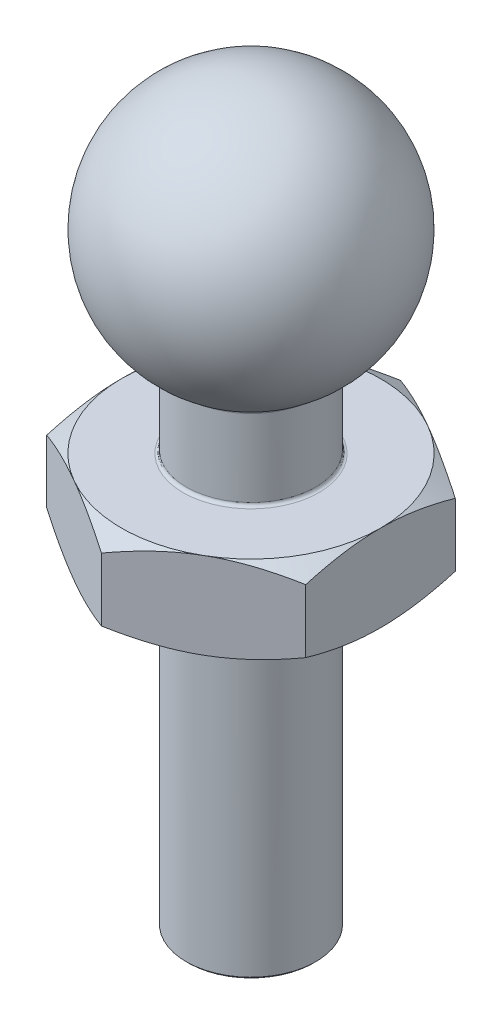
ISO-10303-21;
HEADER;
FILE_DESCRIPTION(('STEP AP214'),'2;1');
FILE_NAME('part.step','',(''),(''),'','','');
FILE_SCHEMA(('AUTOMOTIVE_DESIGN { 1 0 10303 214 1 1 1 1 }'));
ENDSEC;
DATA;
#1=APPLICATION_CONTEXT('core data for automotive mechanical design processes');
#2=APPLICATION_PROTOCOL_DEFINITION('international standard','automotive_design',2000,#1);
#3=PRODUCT_CONTEXT('',#1,'mechanical');
#4=PRODUCT('Part','Part','',(#3));
#5=PRODUCT_RELATED_PRODUCT_CATEGORY('part','',(#4));
#6=PRODUCT_DEFINITION_FORMATION('','',#4);
#7=PRODUCT_DEFINITION_CONTEXT('part definition',#1,'design');
#8=PRODUCT_DEFINITION('design','',#6,#7);
#9=PRODUCT_DEFINITION_SHAPE('','',#8);
#10=(LENGTH_UNIT() NAMED_UNIT(*) SI_UNIT(.MILLI.,.METRE.));
#11=(NAMED_UNIT(*) PLANE_ANGLE_UNIT() SI_UNIT($,.RADIAN.));
#12=(NAMED_UNIT(*) SI_UNIT($,.STERADIAN.) SOLID_ANGLE_UNIT());
#13=UNCERTAINTY_MEASURE_WITH_UNIT(LENGTH_MEASURE(1.E-05),#10,'distance_accuracy_value','');
#14=(GEOMETRIC_REPRESENTATION_CONTEXT(3) GLOBAL_UNCERTAINTY_ASSIGNED_CONTEXT((#13)) GLOBAL_UNIT_ASSIGNED_CONTEXT((#10,
#11,#12)) REPRESENTATION_CONTEXT('',''));
#15=CARTESIAN_POINT('',(0.,0.,0.));
#16=DIRECTION('',(0.,0.,1.));
#17=DIRECTION('',(1.,0.,0.));
#18=AXIS2_PLACEMENT_3D('',#15,#16,#17);
#19=CARTESIAN_POINT('',(0.,9.5,3.46410161513776));
#20=DIRECTION('',(-0.499999999999999,0.,-0.866025403784439));
#21=DIRECTION('',(-0.866025403784439,0.,0.499999999999999));
#22=AXIS2_PLACEMENT_3D('',#19,#20,#21);
#23=PLANE('',#22);
#24=CARTESIAN_POINT('',(-0.000200000000000046,9.23198413756899,3.46421708519159));
#25=CARTESIAN_POINT('',(0.131635206588332,9.27594629554769,3.38810199317915));
#26=CARTESIAN_POINT('',(0.264608405355249,9.31592841370737,3.31132988107607));
#27=CARTESIAN_POINT('',(0.532857420002056,9.38571791955454,3.15645624025988));
#28=CARTESIAN_POINT('',(0.668138002634342,9.41550061773462,3.078351959461));
#29=CARTESIAN_POINT('',(0.937022602096484,9.46186216078874,2.92311136358059));
#30=CARTESIAN_POINT('',(1.07058524542946,9.47874955887705,2.84599893549862));
#31=CARTESIAN_POINT('',(1.33833905729569,9.49891035755148,2.6914112001411));
#32=CARTESIAN_POINT('',(1.47252925247984,9.50220045221892,2.61393645482892));
#33=CARTESIAN_POINT('',(1.72327559769581,9.49535946911461,2.46916798492017));
#34=CARTESIAN_POINT('',(1.83986926497268,9.48690808580738,2.40185259973206));
#35=CARTESIAN_POINT('',(2.07229698497464,9.46012105699296,2.2676603930218));
#36=CARTESIAN_POINT('',(2.18813023365133,9.44177625913829,2.2007840357172));
#37=CARTESIAN_POINT('',(2.42103725705637,9.39591524914667,2.06631510305815));
#38=CARTESIAN_POINT('',(2.53808155051394,9.36820461473692,1.99873954872331));
#39=CARTESIAN_POINT('',(2.77042435049912,9.3053122048626,1.86459637060759));
#40=CARTESIAN_POINT('',(2.88572583417111,9.27014520897844,1.79802702797161));
#41=CARTESIAN_POINT('',(3.0002,9.23198413756899,1.73193533751504));
#42=B_SPLINE_CURVE_WITH_KNOTS('',3,(#24,#25,#26,#27,#28,#29,#30,#31,#32,#33,#34,#35,#36,#37,#38,
#39,#40,#41),.UNSPECIFIED.,.F.,.F.,(4,2,2,2,2,2,2,2,4),(0.,0.475539830103041,0.952222784107964,
1.41710776961288,1.88142182298026,2.28572436316091,2.69040156475039,3.10405572063576,
3.5168974940707),.UNSPECIFIED.);
#43=CARTESIAN_POINT('',(0.,9.23205080756888,3.46410161513776));
#44=VERTEX_POINT('',#43);
#45=CARTESIAN_POINT('',(1.5,9.5,2.59807621135332));
#46=VERTEX_POINT('',#45);
#47=EDGE_CURVE('E165',#44,#46,#42,.T.);
#48=ORIENTED_EDGE('',*,*,#47,.F.);
#49=DIRECTION('',(0.,-1.,0.));
#50=VECTOR('',#49,1.);
#51=CARTESIAN_POINT('',(0.,9.5,3.46410161513776));
#52=LINE('',#51,#50);
#53=CARTESIAN_POINT('',(0.,7.76794919243112,3.46410161513776));
#54=VERTEX_POINT('',#53);
#55=EDGE_CURVE('E304',#44,#54,#52,.T.);
#56=ORIENTED_EDGE('',*,*,#55,.T.);
#57=CARTESIAN_POINT('',(3.0002,7.76801586243101,1.73193533751504));
#58=CARTESIAN_POINT('',(2.86836479341167,7.72405370445231,1.80805042952749));
#59=CARTESIAN_POINT('',(2.73539159464475,7.68407158629263,1.88482254163057));
#60=CARTESIAN_POINT('',(2.46714257999794,7.61428208044547,2.03969618244676));
#61=CARTESIAN_POINT('',(2.33186199736566,7.58449938226538,2.11780046324564));
#62=CARTESIAN_POINT('',(2.06297739790352,7.53813783921126,2.27304105912605));
#63=CARTESIAN_POINT('',(1.92941475457054,7.52125044112295,2.35015348720802));
#64=CARTESIAN_POINT('',(1.66166094270431,7.50108964244852,2.50474122256554));
#65=CARTESIAN_POINT('',(1.52747074752015,7.49779954778108,2.58221596787772));
#66=CARTESIAN_POINT('',(1.27672440230419,7.50464053088539,2.72698443778647));
#67=CARTESIAN_POINT('',(1.16013073502732,7.51309191419262,2.79429982297457));
#68=CARTESIAN_POINT('',(0.927703015025363,7.53987894300704,2.92849202968484));
#69=CARTESIAN_POINT('',(0.811869766348668,7.55822374086171,2.99536838698943));
#70=CARTESIAN_POINT('',(0.578962742943632,7.60408475085333,3.12983731964849));
#71=CARTESIAN_POINT('',(0.461918449486059,7.63179538526308,3.19741287398333));
#72=CARTESIAN_POINT('',(0.229575649500875,7.6946877951374,3.33155605209904));
#73=CARTESIAN_POINT('',(0.114274165828893,7.72985479102156,3.39812539473502));
#74=CARTESIAN_POINT('',(-0.000200000000000246,7.76801586243101,3.46421708519159));
#75=B_SPLINE_CURVE_WITH_KNOTS('',3,(#57,#58,#59,#60,#61,#62,#63,#64,#65,#66,#67,#68,#69,#70,#71,
#72,#73,#74),.UNSPECIFIED.,.F.,.F.,(4,2,2,2,2,2,2,2,4),(0.,0.475539830103041,0.952222784107964,
1.41710776961288,1.88142182298026,2.28572436316091,2.69040156475039,3.10405572063576,
3.5168974940707),.UNSPECIFIED.);
#76=CARTESIAN_POINT('',(1.5,7.5,2.59807621135332));
#77=VERTEX_POINT('',#76);
#78=EDGE_CURVE('E333',#77,#54,#75,.T.);
#79=ORIENTED_EDGE('',*,*,#78,.F.);
#80=CARTESIAN_POINT('',(3.,7.76794919243112,1.73205080756888));
#81=VERTEX_POINT('',#80);
#82=EDGE_CURVE('E338',#81,#77,#75,.T.);
#83=ORIENTED_EDGE('',*,*,#82,.F.);
#84=DIRECTION('',(0.,-1.,0.));
#85=VECTOR('',#84,1.);
#86=CARTESIAN_POINT('',(3.,9.5,1.73205080756888));
#87=LINE('',#86,#85);
#88=CARTESIAN_POINT('',(3.,9.23205080756888,1.73205080756888));
#89=VERTEX_POINT('',#88);
#90=EDGE_CURVE('E312',#89,#81,#87,.T.);
#91=ORIENTED_EDGE('',*,*,#90,.F.);
#92=EDGE_CURVE('E68',#46,#89,#42,.T.);
#93=ORIENTED_EDGE('',*,*,#92,.F.);
#94=EDGE_LOOP('',(#48,#56,#79,#83,#91,#93));
#95=FACE_BOUND('',#94,.T.);
#96=ADVANCED_FACE('F46',(#95),#23,.F.);
#97=CARTESIAN_POINT('',(-3.,9.5,1.73205080756887));
#98=DIRECTION('',(0.500000000000001,0.,-0.866025403784438));
#99=DIRECTION('',(-0.866025403784438,0.,-0.500000000000001));
#100=AXIS2_PLACEMENT_3D('',#97,#98,#99);
#101=PLANE('',#100);
#102=CARTESIAN_POINT('',(-3.0002,9.23198413756899,1.73193533751504));
#103=CARTESIAN_POINT('',(-2.86836479341167,9.27594629554769,1.80805042952748));
#104=CARTESIAN_POINT('',(-2.73539159464475,9.31592841370737,1.88482254163057));
#105=CARTESIAN_POINT('',(-2.46714257999794,9.38571791955454,2.03969618244675));
#106=CARTESIAN_POINT('',(-2.33186199736566,9.41550061773462,2.11780046324563));
#107=CARTESIAN_POINT('',(-2.06297739790352,9.46186216078875,2.27304105912604));
#108=CARTESIAN_POINT('',(-1.92941475457054,9.47874955887705,2.35015348720802));
#109=CARTESIAN_POINT('',(-1.66166094270431,9.49891035755148,2.50474122256553));
#110=CARTESIAN_POINT('',(-1.52747074752016,9.50220045221892,2.58221596787771));
#111=CARTESIAN_POINT('',(-1.27672440230419,9.49535946911461,2.72698443778646));
#112=CARTESIAN_POINT('',(-1.16013073502733,9.48690808580738,2.79429982297457));
#113=CARTESIAN_POINT('',(-0.927703015025365,9.46012105699297,2.92849202968483));
#114=CARTESIAN_POINT('',(-0.81186976634867,9.44177625913829,2.99536838698943));
#115=CARTESIAN_POINT('',(-0.578962742943633,9.39591524914667,3.12983731964848));
#116=CARTESIAN_POINT('',(-0.46191844948606,9.36820461473692,3.19741287398332));
#117=CARTESIAN_POINT('',(-0.229575649500876,9.3053122048626,3.33155605209904));
#118=CARTESIAN_POINT('',(-0.114274165828894,9.27014520897844,3.39812539473502));
#119=CARTESIAN_POINT('',(0.000199999999999645,9.23198413756899,3.46421708519159));
#120=B_SPLINE_CURVE_WITH_KNOTS('',3,(#102,#103,#104,#105,#106,#107,#108,#109,#110,#111,#112,
#113,#114,#115,#116,#117,#118,#119),.UNSPECIFIED.,.F.,.F.,(4,2,2,2,2,2,2,2,4),(0.,
0.475539830103041,0.952222784107964,1.41710776961288,1.88142182298026,2.28572436316091,
2.69040156475039,3.10405572063576,3.5168974940707),.UNSPECIFIED.);
#121=CARTESIAN_POINT('',(-3.,9.23205080756888,1.73205080756887));
#122=VERTEX_POINT('',#121);
#123=CARTESIAN_POINT('',(-1.5,9.5,2.59807621135332));
#124=VERTEX_POINT('',#123);
#125=EDGE_CURVE('E219',#122,#124,#120,.T.);
#126=ORIENTED_EDGE('',*,*,#125,.F.);
#127=DIRECTION('',(0.,-1.,0.));
#128=VECTOR('',#127,1.);
#129=CARTESIAN_POINT('',(-3.,9.5,1.73205080756887));
#130=LINE('',#129,#128);
#131=CARTESIAN_POINT('',(-3.,7.76794919243112,1.73205080756887));
#132=VERTEX_POINT('',#131);
#133=EDGE_CURVE('E311',#122,#132,#130,.T.);
#134=ORIENTED_EDGE('',*,*,#133,.T.);
#135=CARTESIAN_POINT('',(0.0002,7.76801586243101,3.46421708519159));
#136=CARTESIAN_POINT('',(-0.131635206588332,7.72405370445231,3.38810199317915));
#137=CARTESIAN_POINT('',(-0.264608405355249,7.68407158629263,3.31132988107606));
#138=CARTESIAN_POINT('',(-0.532857420002055,7.61428208044547,3.15645624025988));
#139=CARTESIAN_POINT('',(-0.668138002634341,7.58449938226538,3.078351959461));
#140=CARTESIAN_POINT('',(-0.937022602096483,7.53813783921126,2.92311136358059));
#141=CARTESIAN_POINT('',(-1.07058524542946,7.52125044112295,2.84599893549861));
#142=CARTESIAN_POINT('',(-1.33833905729569,7.50108964244852,2.6914112001411));
#143=CARTESIAN_POINT('',(-1.47252925247984,7.49779954778108,2.61393645482892));
#144=CARTESIAN_POINT('',(-1.72327559769581,7.50464053088539,2.46916798492017));
#145=CARTESIAN_POINT('',(-1.83986926497268,7.51309191419262,2.40185259973206));
#146=CARTESIAN_POINT('',(-2.07229698497464,7.53987894300703,2.2676603930218));
#147=CARTESIAN_POINT('',(-2.18813023365133,7.55822374086171,2.2007840357172));
#148=CARTESIAN_POINT('',(-2.42103725705637,7.60408475085333,2.06631510305815));
#149=CARTESIAN_POINT('',(-2.53808155051394,7.63179538526308,1.99873954872331));
#150=CARTESIAN_POINT('',(-2.77042435049913,7.6946877951374,1.86459637060759));
#151=CARTESIAN_POINT('',(-2.88572583417111,7.72985479102156,1.79802702797161));
#152=CARTESIAN_POINT('',(-3.0002,7.76801586243101,1.73193533751504));
#153=B_SPLINE_CURVE_WITH_KNOTS('',3,(#135,#136,#137,#138,#139,#140,#141,#142,#143,#144,#145,
#146,#147,#148,#149,#150,#151,#152),.UNSPECIFIED.,.F.,.F.,(4,2,2,2,2,2,2,2,4),(0.,
0.47553983010304,0.952222784107964,1.41710776961288,1.88142182298026,2.28572436316091,
2.69040156475039,3.10405572063576,3.51689749407071),.UNSPECIFIED.);
#154=CARTESIAN_POINT('',(-1.5,7.5,2.59807621135331));
#155=VERTEX_POINT('',#154);
#156=EDGE_CURVE('E246',#155,#132,#153,.T.);
#157=ORIENTED_EDGE('',*,*,#156,.F.);
#158=EDGE_CURVE('E237',#54,#155,#153,.T.);
#159=ORIENTED_EDGE('',*,*,#158,.F.);
#160=ORIENTED_EDGE('',*,*,#55,.F.);
#161=EDGE_CURVE('E213',#124,#44,#120,.T.);
#162=ORIENTED_EDGE('',*,*,#161,.F.);
#163=EDGE_LOOP('',(#126,#134,#157,#159,#160,#162));
#164=FACE_BOUND('',#163,.T.);
#165=ADVANCED_FACE('F227',(#164),#101,.F.);
#166=CARTESIAN_POINT('',(-3.,9.5,-1.73205080756888));
#167=DIRECTION('',(1.,0.,0.));
#168=DIRECTION('',(0.,0.,-1.));
#169=AXIS2_PLACEMENT_3D('',#166,#167,#168);
#170=PLANE('',#169);
#171=CARTESIAN_POINT('',(-3.,7.49669275597267,-5.73225080756888));
#172=CARTESIAN_POINT('',(-3.,7.56535762873895,-5.59799811373669));
#173=CARTESIAN_POINT('',(-3.,7.63362658074956,-5.46354106552018));
#174=CARTESIAN_POINT('',(-3.,7.7691751977503,-5.19412594711896));
#175=CARTESIAN_POINT('',(-3.,7.83645484167597,-5.05916786634262));
#176=CARTESIAN_POINT('',(-3.,7.96993872408742,-4.78843231789163));
#177=CARTESIAN_POINT('',(-3.,8.0361409223391,-4.65265384244875));
#178=CARTESIAN_POINT('',(-3.,8.16708055525372,-4.38038885038152));
#179=CARTESIAN_POINT('',(-3.,8.23181796851999,-4.24390232345014));
#180=CARTESIAN_POINT('',(-3.,8.36273075239076,-3.96310511366176));
#181=CARTESIAN_POINT('',(-3.,8.42881132731156,-3.81875010473635));
#182=CARTESIAN_POINT('',(-3.,8.55842928727965,-3.52890389215656));
#183=CARTESIAN_POINT('',(-3.,8.62196674541402,-3.38341272129836));
#184=CARTESIAN_POINT('',(-3.,8.74573518476893,-3.0911428032025));
#185=CARTESIAN_POINT('',(-3.,8.80596844827942,-2.94436502804428));
#186=CARTESIAN_POINT('',(-3.,8.92221294586851,-2.64909731827644));
#187=CARTESIAN_POINT('',(-3.,8.97822314680859,-2.50060697487877));
#188=CARTESIAN_POINT('',(-3.,9.09420348606466,-2.17495473766773));
#189=CARTESIAN_POINT('',(-3.,9.15309774811247,-1.99740334689548));
#190=CARTESIAN_POINT('',(-3.,9.26029523419006,-1.63917764376158));
#191=CARTESIAN_POINT('',(-3.,9.30860404614459,-1.45850503366086));
#192=CARTESIAN_POINT('',(-3.,9.39023263279609,-1.09720914532956));
#193=CARTESIAN_POINT('',(-3.,9.42381477693698,-0.916647599895758));
#194=CARTESIAN_POINT('',(-3.,9.46126742176692,-0.644079261802788));
#195=CARTESIAN_POINT('',(-3.,9.47159787377878,-0.552943422867095));
#196=CARTESIAN_POINT('',(-3.,9.48763454600052,-0.370270654947728));
#197=CARTESIAN_POINT('',(-3.,9.49334144079801,-0.27873378643531));
#198=CARTESIAN_POINT('',(-3.,9.49996614854262,-0.0944078517722094));
#199=CARTESIAN_POINT('',(-3.,9.50082686163439,-0.00161671746076108));
#200=CARTESIAN_POINT('',(-3.,9.49757525562797,0.1838775984138));
#201=CARTESIAN_POINT('',(-3.,9.49346292019229,0.276580779686967));
#202=CARTESIAN_POINT('',(-3.,9.48041370767168,0.461668088480514));
#203=CARTESIAN_POINT('',(-3.,9.47147558711607,0.554052127589442));
#204=CARTESIAN_POINT('',(-3.,9.4490819835307,0.738276464049773));
#205=CARTESIAN_POINT('',(-3.,9.43562578745626,0.830116673244043));
#206=CARTESIAN_POINT('',(-3.,9.38848678345653,1.1081241349506));
#207=CARTESIAN_POINT('',(-3.,9.34831083516922,1.29320289274649));
#208=CARTESIAN_POINT('',(-3.,9.25483304091392,1.65992833453579));
#209=CARTESIAN_POINT('',(-3.,9.20152817481691,1.8415742184766));
#210=CARTESIAN_POINT('',(-3.,9.09001482170302,2.18718321983853));
#211=CARTESIAN_POINT('',(-3.,9.03254960886738,2.35139002090273));
#212=CARTESIAN_POINT('',(-3.,8.91157770593576,2.67757637701535));
#213=CARTESIAN_POINT('',(-3.,8.84806982210383,2.83955548471668));
#214=CARTESIAN_POINT('',(-3.,8.71649668995848,3.16180541641892));
#215=CARTESIAN_POINT('',(-3.,8.64842746398323,3.32207460435456));
#216=CARTESIAN_POINT('',(-3.,8.50888164672137,3.64112437712565));
#217=CARTESIAN_POINT('',(-3.,8.43740489080743,3.79990488959461));
#218=CARTESIAN_POINT('',(-3.,8.29572041514807,4.10783154121876));
#219=CARTESIAN_POINT('',(-3.,8.22564804300012,4.25704019529892));
#220=CARTESIAN_POINT('',(-3.,8.0836551872923,4.55457880885657));
#221=CARTESIAN_POINT('',(-3.,8.01173465191385,4.70290874355283));
#222=CARTESIAN_POINT('',(-3.,7.86663085724281,4.99841900754647));
#223=CARTESIAN_POINT('',(-3.,7.79345182235509,5.14560141584992));
#224=CARTESIAN_POINT('',(-3.,7.64590152942626,5.43935321353677));
#225=CARTESIAN_POINT('',(-3.,7.57153036655204,5.58592265068707));
#226=CARTESIAN_POINT('',(-3.,7.49669275597267,5.73225080756888));
#227=B_SPLINE_CURVE_WITH_KNOTS('',3,(#171,#172,#173,#174,#175,#176,#177,#178,#179,#180,#181,
#182,#183,#184,#185,#186,#187,#188,#189,#190,#191,#192,#193,#194,#195,#196,#197,#198,#199,#200,
#201,#202,#203,#204,#205,#206,#207,#208,#209,#210,#211,#212,#213,#214,#215,#216,#217,#218,#219,
#220,#221,#222,#223,#224,#225,#226),.UNSPECIFIED.,.F.,.F.,(4,2,2,2,2,2,2,2,2,2,2,2,2,2,2,2,2,2,
2,2,2,2,2,2,2,2,2,4),(0.,0.452382016001323,0.904773650265351,1.35794045354517,1.81111387213612,
2.2873771437625,2.76362671813268,3.23954308217786,3.71557550010852,4.27652369616462,
4.83717505756687,5.38738613645124,5.66244417939779,5.937462083513,6.21571369559986,
6.4939662218021,6.77229048018743,7.05065868449287,7.61810965270507,8.18569127741243,
8.70745206667822,9.2293161451901,9.75164138486645,10.2739918851653,10.7685068932809,
11.2630357817083,11.756143015984,12.2492110799155),.UNSPECIFIED.);
#228=CARTESIAN_POINT('',(-3.,9.23205080756888,-1.73205080756888));
#229=VERTEX_POINT('',#228);
#230=CARTESIAN_POINT('',(-3.,9.5,0.));
#231=VERTEX_POINT('',#230);
#232=EDGE_CURVE('E368',#229,#231,#227,.T.);
#233=ORIENTED_EDGE('',*,*,#232,.F.);
#234=DIRECTION('',(0.,-1.,0.));
#235=VECTOR('',#234,1.);
#236=CARTESIAN_POINT('',(-3.,9.5,-1.73205080756888));
#237=LINE('',#236,#235);
#238=CARTESIAN_POINT('',(-3.,7.7679491924311,-1.73205080756891));
#239=VERTEX_POINT('',#238);
#240=EDGE_CURVE('E314',#229,#239,#237,.T.);
#241=ORIENTED_EDGE('',*,*,#240,.T.);
#242=CARTESIAN_POINT('',(-3.,9.50330724402733,5.73225080756888));
#243=CARTESIAN_POINT('',(-3.,9.43464237126105,5.59799811373668));
#244=CARTESIAN_POINT('',(-3.,9.36637341925044,5.46354106552017));
#245=CARTESIAN_POINT('',(-3.,9.2308248022497,5.19412594711895));
#246=CARTESIAN_POINT('',(-3.,9.16354515832403,5.05916786634262));
#247=CARTESIAN_POINT('',(-3.,9.03006127591258,4.78843231789163));
#248=CARTESIAN_POINT('',(-3.,8.9638590776609,4.65265384244874));
#249=CARTESIAN_POINT('',(-3.,8.83291944474628,4.38038885038151));
#250=CARTESIAN_POINT('',(-3.,8.76818203148001,4.24390232345014));
#251=CARTESIAN_POINT('',(-3.,8.63726924760924,3.96310511366176));
#252=CARTESIAN_POINT('',(-3.,8.57118867268844,3.81875010473635));
#253=CARTESIAN_POINT('',(-3.,8.44157071272035,3.52890389215655));
#254=CARTESIAN_POINT('',(-3.,8.37803325458598,3.38341272129836));
#255=CARTESIAN_POINT('',(-3.,8.25426481523107,3.09114280320249));
#256=CARTESIAN_POINT('',(-3.,8.19403155172058,2.94436502804427));
#257=CARTESIAN_POINT('',(-3.,8.07778705413149,2.64909731827644));
#258=CARTESIAN_POINT('',(-3.,8.02177685319141,2.50060697487877));
#259=CARTESIAN_POINT('',(-3.,7.90579651393534,2.17495473766773));
#260=CARTESIAN_POINT('',(-3.,7.84690225188753,1.99740334689547));
#261=CARTESIAN_POINT('',(-3.,7.73970476580994,1.63917764376158));
#262=CARTESIAN_POINT('',(-3.,7.69139595385541,1.45850503366086));
#263=CARTESIAN_POINT('',(-3.,7.60976736720391,1.09720914532956));
#264=CARTESIAN_POINT('',(-3.,7.57618522306302,0.916647599895753));
#265=CARTESIAN_POINT('',(-3.,7.53873257823308,0.644079261802783));
#266=CARTESIAN_POINT('',(-3.,7.52840212622122,0.55294342286709));
#267=CARTESIAN_POINT('',(-3.,7.51236545399948,0.370270654947723));
#268=CARTESIAN_POINT('',(-3.,7.50665855920199,0.278733786435305));
#269=CARTESIAN_POINT('',(-3.,7.50003385145738,0.0944078517722043));
#270=CARTESIAN_POINT('',(-3.,7.4991731383656,0.00161671746075588));
#271=CARTESIAN_POINT('',(-3.,7.50242474437203,-0.183877598413805));
#272=CARTESIAN_POINT('',(-3.,7.50653707980771,-0.276580779686973));
#273=CARTESIAN_POINT('',(-3.,7.51958629232832,-0.461668088480519));
#274=CARTESIAN_POINT('',(-3.,7.52852441288393,-0.554052127589447));
#275=CARTESIAN_POINT('',(-3.,7.5509180164693,-0.738276464049777));
#276=CARTESIAN_POINT('',(-3.,7.56437421254374,-0.830116673244047));
#277=CARTESIAN_POINT('',(-3.,7.61151321654347,-1.1081241349506));
#278=CARTESIAN_POINT('',(-3.,7.65168916483078,-1.2932028927465));
#279=CARTESIAN_POINT('',(-3.,7.74516695908608,-1.65992833453579));
#280=CARTESIAN_POINT('',(-3.,7.79847182518309,-1.8415742184766));
#281=CARTESIAN_POINT('',(-3.,7.90998517829698,-2.18718321983853));
#282=CARTESIAN_POINT('',(-3.,7.96745039113262,-2.35139002090274));
#283=CARTESIAN_POINT('',(-3.,8.08842229406424,-2.67757637701536));
#284=CARTESIAN_POINT('',(-3.,8.15193017789617,-2.83955548471668));
#285=CARTESIAN_POINT('',(-3.,8.28350331004152,-3.16180541641892));
#286=CARTESIAN_POINT('',(-3.,8.35157253601678,-3.32207460435457));
#287=CARTESIAN_POINT('',(-3.,8.49111835327863,-3.64112437712565));
#288=CARTESIAN_POINT('',(-3.,8.56259510919257,-3.79990488959462));
#289=CARTESIAN_POINT('',(-3.,8.70427958485193,-4.10783154121877));
#290=CARTESIAN_POINT('',(-3.,8.77435195699987,-4.25704019529893));
#291=CARTESIAN_POINT('',(-3.,8.9163448127077,-4.55457880885657));
#292=CARTESIAN_POINT('',(-3.,8.98826534808615,-4.70290874355283));
#293=CARTESIAN_POINT('',(-3.,9.1333691427572,-4.99841900754648));
#294=CARTESIAN_POINT('',(-3.,9.20654817764491,-5.14560141584992));
#295=CARTESIAN_POINT('',(-3.,9.35409847057374,-5.43935321353678));
#296=CARTESIAN_POINT('',(-3.,9.42846963344796,-5.58592265068707));
#297=CARTESIAN_POINT('',(-3.,9.50330724402733,-5.73225080756888));
#298=B_SPLINE_CURVE_WITH_KNOTS('',3,(#242,#243,#244,#245,#246,#247,#248,#249,#250,#251,#252,
#253,#254,#255,#256,#257,#258,#259,#260,#261,#262,#263,#264,#265,#266,#267,#268,#269,#270,#271,
#272,#273,#274,#275,#276,#277,#278,#279,#280,#281,#282,#283,#284,#285,#286,#287,#288,#289,#290,
#291,#292,#293,#294,#295,#296,#297),.UNSPECIFIED.,.F.,.F.,(4,2,2,2,2,2,2,2,2,2,2,2,2,2,2,2,2,2,
2,2,2,2,2,2,2,2,2,4),(0.,0.452382016001321,0.904773650265347,1.35794045354517,1.81111387213612,
2.2873771437625,2.76362671813268,3.23954308217786,3.71557550010852,4.27652369616462,
4.83717505756687,5.38738613645124,5.66244417939779,5.937462083513,6.21571369559986,
6.4939662218021,6.77229048018743,7.05065868449287,7.61810965270507,8.18569127741243,
8.70745206667821,9.2293161451901,9.75164138486645,10.2739918851653,10.7685068932809,
11.2630357817083,11.756143015984,12.2492110799155),.UNSPECIFIED.);
#299=CARTESIAN_POINT('',(-3.,7.5,0.));
#300=VERTEX_POINT('',#299);
#301=EDGE_CURVE('E384',#300,#239,#298,.T.);
#302=ORIENTED_EDGE('',*,*,#301,.F.);
#303=EDGE_CURVE('E254',#132,#300,#298,.T.);
#304=ORIENTED_EDGE('',*,*,#303,.F.);
#305=ORIENTED_EDGE('',*,*,#133,.F.);
#306=EDGE_CURVE('E220',#231,#122,#227,.T.);
#307=ORIENTED_EDGE('',*,*,#306,.F.);
#308=EDGE_LOOP('',(#233,#241,#302,#304,#305,#307));
#309=FACE_BOUND('',#308,.T.);
#310=ADVANCED_FACE('F230',(#309),#170,.F.);
#311=CARTESIAN_POINT('',(0.,9.5,-3.46410161513775));
#312=DIRECTION('',(0.499999999999999,0.,0.866025403784439));
#313=DIRECTION('',(0.866025403784439,0.,-0.499999999999999));
#314=AXIS2_PLACEMENT_3D('',#311,#312,#313);
#315=PLANE('',#314);
#316=CARTESIAN_POINT('',(0.000200000000003459,9.23198413756899,-3.46421708519159));
#317=CARTESIAN_POINT('',(-0.131635206588328,9.27594629554769,-3.38810199317915));
#318=CARTESIAN_POINT('',(-0.264608405355245,9.31592841370737,-3.31132988107606));
#319=CARTESIAN_POINT('',(-0.532857420002052,9.38571791955454,-3.15645624025988));
#320=CARTESIAN_POINT('',(-0.668138002634338,9.41550061773462,-3.078351959461));
#321=CARTESIAN_POINT('',(-0.93702260209648,9.46186216078874,-2.92311136358059));
#322=CARTESIAN_POINT('',(-1.07058524542946,9.47874955887705,-2.84599893549862));
#323=CARTESIAN_POINT('',(-1.33833905729569,9.49891035755148,-2.6914112001411));
#324=CARTESIAN_POINT('',(-1.47252925247984,9.50220045221892,-2.61393645482892));
#325=CARTESIAN_POINT('',(-1.7232755976958,9.49535946911461,-2.46916798492017));
#326=CARTESIAN_POINT('',(-1.83986926497267,9.48690808580738,-2.40185259973206));
#327=CARTESIAN_POINT('',(-2.07229698497463,9.46012105699297,-2.2676603930218));
#328=CARTESIAN_POINT('',(-2.18813023365133,9.44177625913829,-2.2007840357172));
#329=CARTESIAN_POINT('',(-2.42103725705637,9.39591524914667,-2.06631510305815));
#330=CARTESIAN_POINT('',(-2.53808155051394,9.36820461473692,-1.99873954872331));
#331=CARTESIAN_POINT('',(-2.77042435049912,9.3053122048626,-1.86459637060759));
#332=CARTESIAN_POINT('',(-2.8857258341711,9.27014520897844,-1.79802702797161));
#333=CARTESIAN_POINT('',(-3.0002,9.23198413756899,-1.73193533751504));
#334=B_SPLINE_CURVE_WITH_KNOTS('',3,(#316,#317,#318,#319,#320,#321,#322,#323,#324,#325,#326,
#327,#328,#329,#330,#331,#332,#333),.UNSPECIFIED.,.F.,.F.,(4,2,2,2,2,2,2,2,4),(0.,
0.47553983010304,0.952222784107964,1.41710776961288,1.88142182298026,2.28572436316091,
2.69040156475039,3.10405572063576,3.5168974940707),.UNSPECIFIED.);
#335=CARTESIAN_POINT('',(0.,9.23205080756888,-3.46410161513775));
#336=VERTEX_POINT('',#335);
#337=CARTESIAN_POINT('',(-1.5,9.5,-2.59807621135332));
#338=VERTEX_POINT('',#337);
#339=EDGE_CURVE('E143',#336,#338,#334,.T.);
#340=ORIENTED_EDGE('',*,*,#339,.F.);
#341=DIRECTION('',(0.,-1.,0.));
#342=VECTOR('',#341,1.);
#343=CARTESIAN_POINT('',(0.,9.5,-3.46410161513775));
#344=LINE('',#343,#342);
#345=CARTESIAN_POINT('',(0.,7.76794919243112,-3.46410161513775));
#346=VERTEX_POINT('',#345);
#347=EDGE_CURVE('E164',#336,#346,#344,.T.);
#348=ORIENTED_EDGE('',*,*,#347,.T.);
#349=CARTESIAN_POINT('',(-3.0002,7.76801586243101,-1.73193533751504));
#350=CARTESIAN_POINT('',(-2.86836479341167,7.72405370445231,-1.80805042952749));
#351=CARTESIAN_POINT('',(-2.73539159464475,7.68407158629263,-1.88482254163057));
#352=CARTESIAN_POINT('',(-2.46714257999794,7.61428208044547,-2.03969618244676));
#353=CARTESIAN_POINT('',(-2.33186199736566,7.58449938226538,-2.11780046324564));
#354=CARTESIAN_POINT('',(-2.06297739790351,7.53813783921126,-2.27304105912605));
#355=CARTESIAN_POINT('',(-1.92941475457054,7.52125044112295,-2.35015348720802));
#356=CARTESIAN_POINT('',(-1.66166094270431,7.50108964244852,-2.50474122256554));
#357=CARTESIAN_POINT('',(-1.52747074752015,7.49779954778108,-2.58221596787771));
#358=CARTESIAN_POINT('',(-1.27672440230419,7.50464053088539,-2.72698443778647));
#359=CARTESIAN_POINT('',(-1.16013073502732,7.51309191419262,-2.79429982297457));
#360=CARTESIAN_POINT('',(-0.927703015025361,7.53987894300703,-2.92849202968483));
#361=CARTESIAN_POINT('',(-0.811869766348666,7.55822374086171,-2.99536838698943));
#362=CARTESIAN_POINT('',(-0.57896274294363,7.60408475085333,-3.12983731964848));
#363=CARTESIAN_POINT('',(-0.461918449486057,7.63179538526308,-3.19741287398332));
#364=CARTESIAN_POINT('',(-0.229575649500872,7.6946877951374,-3.33155605209904));
#365=CARTESIAN_POINT('',(-0.114274165828891,7.72985479102156,-3.39812539473502));
#366=CARTESIAN_POINT('',(0.000200000000003114,7.76801586243101,-3.46421708519159));
#367=B_SPLINE_CURVE_WITH_KNOTS('',3,(#349,#350,#351,#352,#353,#354,#355,#356,#357,#358,#359,
#360,#361,#362,#363,#364,#365,#366),.UNSPECIFIED.,.F.,.F.,(4,2,2,2,2,2,2,2,4),(0.,
0.475539830103041,0.952222784107965,1.41710776961288,1.88142182298026,2.28572436316091,
2.69040156475039,3.10405572063576,3.5168974940707),.UNSPECIFIED.);
#368=CARTESIAN_POINT('',(-1.5,7.5,-2.59807621135332));
#369=VERTEX_POINT('',#368);
#370=EDGE_CURVE('E389',#369,#346,#367,.T.);
#371=ORIENTED_EDGE('',*,*,#370,.F.);
#372=EDGE_CURVE('E316',#239,#369,#367,.T.);
#373=ORIENTED_EDGE('',*,*,#372,.F.);
#374=ORIENTED_EDGE('',*,*,#240,.F.);
#375=EDGE_CURVE('E373',#338,#229,#334,.T.);
#376=ORIENTED_EDGE('',*,*,#375,.F.);
#377=EDGE_LOOP('',(#340,#348,#371,#373,#374,#376));
#378=FACE_BOUND('',#377,.T.);
#379=ADVANCED_FACE('F405',(#378),#315,.F.);
#380=CARTESIAN_POINT('',(3.,9.5,-1.73205080756888));
#381=DIRECTION('',(-0.500000000000001,0.,0.866025403784438));
#382=DIRECTION('',(0.866025403784438,0.,0.500000000000001));
#383=AXIS2_PLACEMENT_3D('',#380,#381,#382);
#384=PLANE('',#383);
#385=CARTESIAN_POINT('',(3.0002,9.23198413756899,-1.73193533751504));
#386=CARTESIAN_POINT('',(2.86836479341167,9.27594629554769,-1.80805042952748));
#387=CARTESIAN_POINT('',(2.73539159464475,9.31592841370737,-1.88482254163057));
#388=CARTESIAN_POINT('',(2.46714257999795,9.38571791955454,-2.03969618244675));
#389=CARTESIAN_POINT('',(2.33186199736566,9.41550061773462,-2.11780046324563));
#390=CARTESIAN_POINT('',(2.06297739790352,9.46186216078874,-2.27304105912605));
#391=CARTESIAN_POINT('',(1.92941475457054,9.47874955887705,-2.35015348720802));
#392=CARTESIAN_POINT('',(1.66166094270431,9.49891035755148,-2.50474122256553));
#393=CARTESIAN_POINT('',(1.52747074752016,9.50220045221892,-2.58221596787771));
#394=CARTESIAN_POINT('',(1.2767244023042,9.49535946911461,-2.72698443778646));
#395=CARTESIAN_POINT('',(1.16013073502733,9.48690808580738,-2.79429982297457));
#396=CARTESIAN_POINT('',(0.927703015025366,9.46012105699296,-2.92849202968483));
#397=CARTESIAN_POINT('',(0.811869766348671,9.44177625913829,-2.99536838698943));
#398=CARTESIAN_POINT('',(0.578962742943635,9.39591524914667,-3.12983731964848));
#399=CARTESIAN_POINT('',(0.461918449486062,9.36820461473692,-3.19741287398332));
#400=CARTESIAN_POINT('',(0.229575649500878,9.3053122048626,-3.33155605209904));
#401=CARTESIAN_POINT('',(0.114274165828896,9.27014520897844,-3.39812539473502));
#402=CARTESIAN_POINT('',(-0.000199999999996572,9.23198413756899,-3.46421708519159));
#403=B_SPLINE_CURVE_WITH_KNOTS('',3,(#385,#386,#387,#388,#389,#390,#391,#392,#393,#394,#395,
#396,#397,#398,#399,#400,#401,#402),.UNSPECIFIED.,.F.,.F.,(4,2,2,2,2,2,2,2,4),(0.,
0.475539830103041,0.952222784107964,1.41710776961288,1.88142182298026,2.28572436316091,
2.69040156475039,3.10405572063576,3.5168974940707),.UNSPECIFIED.);
#404=CARTESIAN_POINT('',(3.,9.2320508075689,-1.73205080756891));
#405=VERTEX_POINT('',#404);
#406=CARTESIAN_POINT('',(1.5,9.5,-2.59807621135332));
#407=VERTEX_POINT('',#406);
#408=EDGE_CURVE('E153',#405,#407,#403,.T.);
#409=ORIENTED_EDGE('',*,*,#408,.F.);
#410=DIRECTION('',(0.,-1.,0.));
#411=VECTOR('',#410,1.);
#412=CARTESIAN_POINT('',(3.,9.5,-1.73205080756888));
#413=LINE('',#412,#411);
#414=CARTESIAN_POINT('',(3.,7.76794919243112,-1.73205080756888));
#415=VERTEX_POINT('',#414);
#416=EDGE_CURVE('E322',#405,#415,#413,.T.);
#417=ORIENTED_EDGE('',*,*,#416,.T.);
#418=CARTESIAN_POINT('',(-0.000199999999996644,7.76801586243101,-3.46421708519159));
#419=CARTESIAN_POINT('',(0.131635206588335,7.7240537044523,-3.38810199317915));
#420=CARTESIAN_POINT('',(0.264608405355253,7.68407158629263,-3.31132988107606));
#421=CARTESIAN_POINT('',(0.532857420002059,7.61428208044547,-3.15645624025988));
#422=CARTESIAN_POINT('',(0.668138002634345,7.58449938226538,-3.078351959461));
#423=CARTESIAN_POINT('',(0.937022602096486,7.53813783921126,-2.92311136358059));
#424=CARTESIAN_POINT('',(1.07058524542946,7.52125044112295,-2.84599893549861));
#425=CARTESIAN_POINT('',(1.33833905729569,7.50108964244852,-2.6914112001411));
#426=CARTESIAN_POINT('',(1.47252925247985,7.49779954778108,-2.61393645482892));
#427=CARTESIAN_POINT('',(1.72327559769581,7.50464053088539,-2.46916798492017));
#428=CARTESIAN_POINT('',(1.83986926497268,7.51309191419262,-2.40185259973206));
#429=CARTESIAN_POINT('',(2.07229698497464,7.53987894300703,-2.2676603930218));
#430=CARTESIAN_POINT('',(2.18813023365133,7.55822374086171,-2.2007840357172));
#431=CARTESIAN_POINT('',(2.42103725705637,7.60408475085333,-2.06631510305815));
#432=CARTESIAN_POINT('',(2.53808155051394,7.63179538526308,-1.99873954872331));
#433=CARTESIAN_POINT('',(2.77042435049913,7.6946877951374,-1.86459637060759));
#434=CARTESIAN_POINT('',(2.88572583417111,7.72985479102156,-1.79802702797161));
#435=CARTESIAN_POINT('',(3.0002,7.76801586243101,-1.73193533751504));
#436=B_SPLINE_CURVE_WITH_KNOTS('',3,(#418,#419,#420,#421,#422,#423,#424,#425,#426,#427,#428,
#429,#430,#431,#432,#433,#434,#435),.UNSPECIFIED.,.F.,.F.,(4,2,2,2,2,2,2,2,4),(0.,
0.475539830103041,0.952222784107964,1.41710776961288,1.88142182298026,2.28572436316091,
2.69040156475039,3.10405572063576,3.5168974940707),.UNSPECIFIED.);
#437=CARTESIAN_POINT('',(1.5,7.5,-2.59807621135332));
#438=VERTEX_POINT('',#437);
#439=EDGE_CURVE('E386',#438,#415,#436,.T.);
#440=ORIENTED_EDGE('',*,*,#439,.F.);
#441=EDGE_CURVE('E388',#346,#438,#436,.T.);
#442=ORIENTED_EDGE('',*,*,#441,.F.);
#443=ORIENTED_EDGE('',*,*,#347,.F.);
#444=EDGE_CURVE('E141',#407,#336,#403,.T.);
#445=ORIENTED_EDGE('',*,*,#444,.F.);
#446=EDGE_LOOP('',(#409,#417,#440,#442,#443,#445));
#447=FACE_BOUND('',#446,.T.);
#448=ADVANCED_FACE('F162',(#447),#384,.F.);
#449=CARTESIAN_POINT('',(3.,9.5,1.73205080756888));
#450=DIRECTION('',(-1.,0.,0.));
#451=DIRECTION('',(0.,0.,1.));
#452=AXIS2_PLACEMENT_3D('',#449,#450,#451);
#453=PLANE('',#452);
#454=CARTESIAN_POINT('',(3.,7.49669275597267,5.73225080756888));
#455=CARTESIAN_POINT('',(3.,7.56535762873894,5.59799811373669));
#456=CARTESIAN_POINT('',(3.,7.63362658074956,5.46354106552018));
#457=CARTESIAN_POINT('',(3.,7.7691751977503,5.19412594711896));
#458=CARTESIAN_POINT('',(3.,7.83645484167597,5.05916786634262));
#459=CARTESIAN_POINT('',(3.,7.96993872408742,4.78843231789163));
#460=CARTESIAN_POINT('',(3.,8.0361409223391,4.65265384244875));
#461=CARTESIAN_POINT('',(3.,8.16708055525372,4.38038885038152));
#462=CARTESIAN_POINT('',(3.,8.23181796851999,4.24390232345015));
#463=CARTESIAN_POINT('',(3.,8.36273075239076,3.96310511366177));
#464=CARTESIAN_POINT('',(3.,8.42881132731156,3.81875010473635));
#465=CARTESIAN_POINT('',(3.,8.55842928727965,3.52890389215656));
#466=CARTESIAN_POINT('',(3.,8.62196674541402,3.38341272129837));
#467=CARTESIAN_POINT('',(3.,8.74573518476893,3.0911428032025));
#468=CARTESIAN_POINT('',(3.,8.80596844827941,2.94436502804428));
#469=CARTESIAN_POINT('',(3.,8.92221294586851,2.64909731827645));
#470=CARTESIAN_POINT('',(3.,8.97822314680859,2.50060697487878));
#471=CARTESIAN_POINT('',(3.,9.09420348606466,2.17495473766774));
#472=CARTESIAN_POINT('',(3.,9.15309774811246,1.99740334689548));
#473=CARTESIAN_POINT('',(3.,9.26029523419006,1.63917764376159));
#474=CARTESIAN_POINT('',(3.,9.30860404614459,1.45850503366087));
#475=CARTESIAN_POINT('',(3.,9.39023263279609,1.09720914532956));
#476=CARTESIAN_POINT('',(3.,9.42381477693698,0.91664759989576));
#477=CARTESIAN_POINT('',(3.,9.46126742176692,0.644079261802789));
#478=CARTESIAN_POINT('',(3.,9.47159787377878,0.552943422867096));
#479=CARTESIAN_POINT('',(3.,9.48763454600052,0.37027065494773));
#480=CARTESIAN_POINT('',(3.,9.49334144079801,0.278733786435312));
#481=CARTESIAN_POINT('',(3.,9.49996614854262,0.0944078517722109));
#482=CARTESIAN_POINT('',(3.,9.50082686163439,0.00161671746076236));
#483=CARTESIAN_POINT('',(3.,9.49757525562797,-0.183877598413798));
#484=CARTESIAN_POINT('',(3.,9.49346292019229,-0.276580779686966));
#485=CARTESIAN_POINT('',(3.,9.48041370767168,-0.461668088480513));
#486=CARTESIAN_POINT('',(3.,9.47147558711607,-0.554052127589441));
#487=CARTESIAN_POINT('',(3.,9.4490819835307,-0.738276464049772));
#488=CARTESIAN_POINT('',(3.,9.43562578745626,-0.830116673244042));
#489=CARTESIAN_POINT('',(3.,9.38848678345653,-1.1081241349506));
#490=CARTESIAN_POINT('',(3.,9.34831083516922,-1.29320289274649));
#491=CARTESIAN_POINT('',(3.,9.25483304091392,-1.65992833453579));
#492=CARTESIAN_POINT('',(3.,9.20152817481691,-1.8415742184766));
#493=CARTESIAN_POINT('',(3.,9.09001482170302,-2.18718321983853));
#494=CARTESIAN_POINT('',(3.,9.03254960886738,-2.35139002090273));
#495=CARTESIAN_POINT('',(3.,8.91157770593577,-2.67757637701535));
#496=CARTESIAN_POINT('',(3.,8.84806982210383,-2.83955548471668));
#497=CARTESIAN_POINT('',(3.,8.71649668995848,-3.16180541641892));
#498=CARTESIAN_POINT('',(3.,8.64842746398323,-3.32207460435456));
#499=CARTESIAN_POINT('',(3.,8.50888164672137,-3.64112437712565));
#500=CARTESIAN_POINT('',(3.,8.43740489080743,-3.79990488959461));
#501=CARTESIAN_POINT('',(3.,8.29572041514807,-4.10783154121876));
#502=CARTESIAN_POINT('',(3.,8.22564804300012,-4.25704019529893));
#503=CARTESIAN_POINT('',(3.,8.0836551872923,-4.55457880885657));
#504=CARTESIAN_POINT('',(3.,8.01173465191385,-4.70290874355283));
#505=CARTESIAN_POINT('',(3.,7.8666308572428,-4.99841900754647));
#506=CARTESIAN_POINT('',(3.,7.79345182235509,-5.14560141584992));
#507=CARTESIAN_POINT('',(3.,7.64590152942625,-5.43935321353677));
#508=CARTESIAN_POINT('',(3.,7.57153036655204,-5.58592265068707));
#509=CARTESIAN_POINT('',(3.,7.49669275597267,-5.73225080756888));
#510=B_SPLINE_CURVE_WITH_KNOTS('',3,(#454,#455,#456,#457,#458,#459,#460,#461,#462,#463,#464,
#465,#466,#467,#468,#469,#470,#471,#472,#473,#474,#475,#476,#477,#478,#479,#480,#481,#482,#483,
#484,#485,#486,#487,#488,#489,#490,#491,#492,#493,#494,#495,#496,#497,#498,#499,#500,#501,#502,
#503,#504,#505,#506,#507,#508,#509),.UNSPECIFIED.,.F.,.F.,(4,2,2,2,2,2,2,2,2,2,2,2,2,2,2,2,2,2,
2,2,2,2,2,2,2,2,2,4),(0.,0.452382016001322,0.90477365026535,1.35794045354517,1.81111387213612,
2.2873771437625,2.76362671813268,3.23954308217786,3.71557550010853,4.27652369616462,
4.83717505756687,5.38738613645125,5.66244417939779,5.93746208351301,6.21571369559987,
6.49396622180211,6.77229048018744,7.05065868449288,7.61810965270508,8.18569127741244,
8.70745206667822,9.2293161451901,9.75164138486646,10.2739918851653,10.7685068932809,
11.2630357817083,11.756143015984,12.2492110799155),.UNSPECIFIED.);
#511=CARTESIAN_POINT('',(3.,9.5,0.));
#512=VERTEX_POINT('',#511);
#513=EDGE_CURVE('E61',#89,#512,#510,.T.);
#514=ORIENTED_EDGE('',*,*,#513,.F.);
#515=ORIENTED_EDGE('',*,*,#90,.T.);
#516=CARTESIAN_POINT('',(3.,9.50330724402733,-5.73225080756888));
#517=CARTESIAN_POINT('',(3.,9.43464237126105,-5.59799811373669));
#518=CARTESIAN_POINT('',(3.,9.36637341925044,-5.46354106552018));
#519=CARTESIAN_POINT('',(3.,9.2308248022497,-5.19412594711896));
#520=CARTESIAN_POINT('',(3.,9.16354515832403,-5.05916786634262));
#521=CARTESIAN_POINT('',(3.,9.03006127591258,-4.78843231789163));
#522=CARTESIAN_POINT('',(3.,8.9638590776609,-4.65265384244875));
#523=CARTESIAN_POINT('',(3.,8.83291944474628,-4.38038885038151));
#524=CARTESIAN_POINT('',(3.,8.76818203148001,-4.24390232345014));
#525=CARTESIAN_POINT('',(3.,8.63726924760924,-3.96310511366176));
#526=CARTESIAN_POINT('',(3.,8.57118867268844,-3.81875010473635));
#527=CARTESIAN_POINT('',(3.,8.44157071272035,-3.52890389215656));
#528=CARTESIAN_POINT('',(3.,8.37803325458598,-3.38341272129836));
#529=CARTESIAN_POINT('',(3.,8.25426481523107,-3.09114280320249));
#530=CARTESIAN_POINT('',(3.,8.19403155172058,-2.94436502804427));
#531=CARTESIAN_POINT('',(3.,8.07778705413149,-2.64909731827644));
#532=CARTESIAN_POINT('',(3.,8.02177685319141,-2.50060697487877));
#533=CARTESIAN_POINT('',(3.,7.90579651393534,-2.17495473766773));
#534=CARTESIAN_POINT('',(3.,7.84690225188754,-1.99740334689548));
#535=CARTESIAN_POINT('',(3.,7.73970476580994,-1.63917764376158));
#536=CARTESIAN_POINT('',(3.,7.69139595385541,-1.45850503366086));
#537=CARTESIAN_POINT('',(3.,7.60976736720391,-1.09720914532956));
#538=CARTESIAN_POINT('',(3.,7.57618522306302,-0.916647599895754));
#539=CARTESIAN_POINT('',(3.,7.53873257823308,-0.644079261802783));
#540=CARTESIAN_POINT('',(3.,7.52840212622122,-0.55294342286709));
#541=CARTESIAN_POINT('',(3.,7.51236545399948,-0.370270654947723));
#542=CARTESIAN_POINT('',(3.,7.50665855920199,-0.278733786435305));
#543=CARTESIAN_POINT('',(3.,7.50003385145738,-0.0944078517722046));
#544=CARTESIAN_POINT('',(3.,7.4991731383656,-0.00161671746075609));
#545=CARTESIAN_POINT('',(3.,7.50242474437203,0.183877598413805));
#546=CARTESIAN_POINT('',(3.,7.50653707980771,0.276580779686973));
#547=CARTESIAN_POINT('',(3.,7.51958629232832,0.461668088480519));
#548=CARTESIAN_POINT('',(3.,7.52852441288393,0.554052127589447));
#549=CARTESIAN_POINT('',(3.,7.5509180164693,0.738276464049778));
#550=CARTESIAN_POINT('',(3.,7.56437421254374,0.830116673244047));
#551=CARTESIAN_POINT('',(3.,7.61151321654347,1.1081241349506));
#552=CARTESIAN_POINT('',(3.,7.65168916483078,1.2932028927465));
#553=CARTESIAN_POINT('',(3.,7.74516695908608,1.65992833453579));
#554=CARTESIAN_POINT('',(3.,7.7984718251831,1.8415742184766));
#555=CARTESIAN_POINT('',(3.,7.90998517829698,2.18718321983853));
#556=CARTESIAN_POINT('',(3.,7.96745039113262,2.35139002090274));
#557=CARTESIAN_POINT('',(3.,8.08842229406423,2.67757637701536));
#558=CARTESIAN_POINT('',(3.,8.15193017789617,2.83955548471668));
#559=CARTESIAN_POINT('',(3.,8.28350331004152,3.16180541641892));
#560=CARTESIAN_POINT('',(3.,8.35157253601678,3.32207460435457));
#561=CARTESIAN_POINT('',(3.,8.49111835327864,3.64112437712566));
#562=CARTESIAN_POINT('',(3.,8.56259510919258,3.79990488959462));
#563=CARTESIAN_POINT('',(3.,8.70427958485193,4.10783154121877));
#564=CARTESIAN_POINT('',(3.,8.77435195699988,4.25704019529894));
#565=CARTESIAN_POINT('',(3.,8.9163448127077,4.55457880885658));
#566=CARTESIAN_POINT('',(3.,8.98826534808616,4.70290874355284));
#567=CARTESIAN_POINT('',(3.,9.1333691427572,4.99841900754648));
#568=CARTESIAN_POINT('',(3.,9.20654817764491,5.14560141584993));
#569=CARTESIAN_POINT('',(3.,9.35409847057375,5.43935321353678));
#570=CARTESIAN_POINT('',(3.,9.42846963344796,5.58592265068708));
#571=CARTESIAN_POINT('',(3.,9.50330724402733,5.73225080756888));
#572=B_SPLINE_CURVE_WITH_KNOTS('',3,(#516,#517,#518,#519,#520,#521,#522,#523,#524,#525,#526,
#527,#528,#529,#530,#531,#532,#533,#534,#535,#536,#537,#538,#539,#540,#541,#542,#543,#544,#545,
#546,#547,#548,#549,#550,#551,#552,#553,#554,#555,#556,#557,#558,#559,#560,#561,#562,#563,#564,
#565,#566,#567,#568,#569,#570,#571),.UNSPECIFIED.,.F.,.F.,(4,2,2,2,2,2,2,2,2,2,2,2,2,2,2,2,2,2,
2,2,2,2,2,2,2,2,2,4),(0.,0.452382016001321,0.904773650265347,1.35794045354517,1.81111387213612,
2.2873771437625,2.76362671813268,3.23954308217786,3.71557550010853,4.27652369616462,
4.83717505756687,5.38738613645125,5.66244417939779,5.93746208351301,6.21571369559987,
6.4939662218021,6.77229048018743,7.05065868449288,7.61810965270508,8.18569127741244,
8.70745206667822,9.2293161451901,9.75164138486646,10.2739918851653,10.7685068932809,
11.2630357817083,11.756143015984,12.2492110799155),.UNSPECIFIED.);
#573=CARTESIAN_POINT('',(3.,7.5,0.));
#574=VERTEX_POINT('',#573);
#575=EDGE_CURVE('E244',#574,#81,#572,.T.);
#576=ORIENTED_EDGE('',*,*,#575,.F.);
#577=EDGE_CURVE('E253',#415,#574,#572,.T.);
#578=ORIENTED_EDGE('',*,*,#577,.F.);
#579=ORIENTED_EDGE('',*,*,#416,.F.);
#580=EDGE_CURVE('E156',#512,#405,#510,.T.);
#581=ORIENTED_EDGE('',*,*,#580,.F.);
#582=EDGE_LOOP('',(#514,#515,#576,#578,#579,#581));
#583=FACE_BOUND('',#582,.T.);
#584=ADVANCED_FACE('F260',(#583),#453,.F.);
#585=CARTESIAN_POINT('',(0.,7.5,0.));
#586=DIRECTION('',(0.,1.,0.));
#587=DIRECTION('',(0.,0.,1.));
#588=AXIS2_PLACEMENT_3D('',#585,#586,#587);
#589=PLANE('',#588);
#590=CARTESIAN_POINT('',(0.,7.5,0.));
#591=DIRECTION('',(0.,1.,0.));
#592=DIRECTION('',(0.,0.,1.));
#593=AXIS2_PLACEMENT_3D('',#590,#591,#592);
#594=CIRCLE('',#593,1.5);
#595=CARTESIAN_POINT('',(0.,7.5,1.5));
#596=VERTEX_POINT('',#595);
#597=EDGE_CURVE('E324',#596,#596,#594,.T.);
#598=ORIENTED_EDGE('',*,*,#597,.T.);
#599=EDGE_LOOP('',(#598));
#600=FACE_BOUND('',#599,.T.);
#601=CARTESIAN_POINT('',(0.,7.5,0.));
#602=DIRECTION('',(0.,-1.,0.));
#603=DIRECTION('',(0.,0.,-1.));
#604=AXIS2_PLACEMENT_3D('',#601,#602,#603);
#605=CIRCLE('',#604,3.);
#606=EDGE_CURVE('E355',#574,#77,#605,.T.);
#607=ORIENTED_EDGE('',*,*,#606,.T.);
#608=EDGE_CURVE('E359',#77,#155,#605,.T.);
#609=ORIENTED_EDGE('',*,*,#608,.T.);
#610=EDGE_CURVE('E363',#155,#300,#605,.T.);
#611=ORIENTED_EDGE('',*,*,#610,.T.);
#612=EDGE_CURVE('E367',#300,#369,#605,.T.);
#613=ORIENTED_EDGE('',*,*,#612,.T.);
#614=EDGE_CURVE('E366',#369,#438,#605,.T.);
#615=ORIENTED_EDGE('',*,*,#614,.T.);
#616=EDGE_CURVE('E245',#438,#574,#605,.T.);
#617=ORIENTED_EDGE('',*,*,#616,.T.);
#618=EDGE_LOOP('',(#607,#609,#611,#613,#615,#617));
#619=FACE_BOUND('',#618,.T.);
#620=ADVANCED_FACE('F264',(#600,#619),#589,.F.);
#621=CARTESIAN_POINT('',(0.,11.,0.));
#622=DIRECTION('',(0.,1.,0.));
#623=DIRECTION('',(-1.,0.,0.));
#624=AXIS2_PLACEMENT_3D('',#621,#622,#623);
#625=CYLINDRICAL_SURFACE('',#624,1.5);
#626=CARTESIAN_POINT('',(0.,0.0499999999999997,0.));
#627=DIRECTION('',(0.,1.,0.));
#628=DIRECTION('',(-1.,0.,0.));
#629=AXIS2_PLACEMENT_3D('',#626,#627,#628);
#630=CIRCLE('',#629,1.5);
#631=CARTESIAN_POINT('',(-1.5,0.0499999999999998,0.));
#632=VERTEX_POINT('',#631);
#633=EDGE_CURVE('E328',#632,#632,#630,.T.);
#634=ORIENTED_EDGE('',*,*,#633,.T.);
#635=EDGE_LOOP('',(#634));
#636=FACE_BOUND('',#635,.T.);
#637=ORIENTED_EDGE('',*,*,#597,.F.);
#638=EDGE_LOOP('',(#637));
#639=FACE_BOUND('',#638,.T.);
#640=ADVANCED_FACE('F271',(#636,#639),#625,.T.);
#641=CARTESIAN_POINT('',(0.,0.,0.));
#642=DIRECTION('',(0.,1.,0.));
#643=DIRECTION('',(-1.,0.,0.));
#644=AXIS2_PLACEMENT_3D('',#641,#642,#643);
#645=PLANE('',#644);
#646=CARTESIAN_POINT('',(0.,0.,0.));
#647=DIRECTION('',(0.,1.,0.));
#648=DIRECTION('',(-1.,0.,0.));
#649=AXIS2_PLACEMENT_3D('',#646,#647,#648);
#650=CIRCLE('',#649,1.45);
#651=CARTESIAN_POINT('',(-1.45,0.,0.));
#652=VERTEX_POINT('',#651);
#653=EDGE_CURVE('E331',#652,#652,#650,.F.);
#654=ORIENTED_EDGE('',*,*,#653,.T.);
#655=EDGE_LOOP('',(#654));
#656=FACE_BOUND('',#655,.T.);
#657=ADVANCED_FACE('F266',(#656),#645,.F.);
#658=CARTESIAN_POINT('',(0.,0.0499999999999997,0.));
#659=DIRECTION('',(0.,1.,0.));
#660=DIRECTION('',(-1.,0.,0.));
#661=AXIS2_PLACEMENT_3D('',#658,#659,#660);
#662=CONICAL_SURFACE('',#661,1.5,0.785398163397446);
#663=ORIENTED_EDGE('',*,*,#653,.F.);
#664=EDGE_LOOP('',(#663));
#665=FACE_BOUND('',#664,.T.);
#666=ORIENTED_EDGE('',*,*,#633,.F.);
#667=EDGE_LOOP('',(#666));
#668=FACE_BOUND('',#667,.T.);
#669=ADVANCED_FACE('F270',(#665,#668),#662,.T.);
#670=CARTESIAN_POINT('',(0.,7.5,0.));
#671=DIRECTION('',(0.,1.,0.));
#672=DIRECTION('',(0.,0.,-1.));
#673=AXIS2_PLACEMENT_3D('',#670,#671,#672);
#674=CONICAL_SURFACE('',#673,3.,1.0471975511966);
#675=ORIENTED_EDGE('',*,*,#158,.T.);
#676=ORIENTED_EDGE('',*,*,#608,.F.);
#677=ORIENTED_EDGE('',*,*,#78,.T.);
#678=EDGE_LOOP('',(#675,#676,#677));
#679=FACE_BOUND('',#678,.T.);
#680=ADVANCED_FACE('F286',(#679),#674,.T.);
#681=ORIENTED_EDGE('',*,*,#575,.T.);
#682=ORIENTED_EDGE('',*,*,#82,.T.);
#683=ORIENTED_EDGE('',*,*,#606,.F.);
#684=EDGE_LOOP('',(#681,#682,#683));
#685=FACE_BOUND('',#684,.T.);
#686=ADVANCED_FACE('F353',(#685),#674,.T.);
#687=ORIENTED_EDGE('',*,*,#303,.T.);
#688=ORIENTED_EDGE('',*,*,#610,.F.);
#689=ORIENTED_EDGE('',*,*,#156,.T.);
#690=EDGE_LOOP('',(#687,#688,#689));
#691=FACE_BOUND('',#690,.T.);
#692=ADVANCED_FACE('F416',(#691),#674,.T.);
#693=ORIENTED_EDGE('',*,*,#372,.T.);
#694=ORIENTED_EDGE('',*,*,#612,.F.);
#695=ORIENTED_EDGE('',*,*,#301,.T.);
#696=EDGE_LOOP('',(#693,#694,#695));
#697=FACE_BOUND('',#696,.T.);
#698=ADVANCED_FACE('F192',(#697),#674,.T.);
#699=ORIENTED_EDGE('',*,*,#370,.T.);
#700=ORIENTED_EDGE('',*,*,#441,.T.);
#701=ORIENTED_EDGE('',*,*,#614,.F.);
#702=EDGE_LOOP('',(#699,#700,#701));
#703=FACE_BOUND('',#702,.T.);
#704=ADVANCED_FACE('F423',(#703),#674,.T.);
#705=ORIENTED_EDGE('',*,*,#439,.T.);
#706=ORIENTED_EDGE('',*,*,#577,.T.);
#707=ORIENTED_EDGE('',*,*,#616,.F.);
#708=EDGE_LOOP('',(#705,#706,#707));
#709=FACE_BOUND('',#708,.T.);
#710=ADVANCED_FACE('F418',(#709),#674,.T.);
#711=CARTESIAN_POINT('',(0.,9.5,0.));
#712=DIRECTION('',(0.,-1.,0.));
#713=DIRECTION('',(0.,0.,1.));
#714=AXIS2_PLACEMENT_3D('',#711,#712,#713);
#715=CONICAL_SURFACE('',#714,3.,1.0471975511966);
#716=ORIENTED_EDGE('',*,*,#408,.T.);
#717=CARTESIAN_POINT('',(0.,9.5,0.));
#718=DIRECTION('',(0.,1.,0.));
#719=DIRECTION('',(0.,0.,1.));
#720=AXIS2_PLACEMENT_3D('',#717,#718,#719);
#721=CIRCLE('',#720,3.);
#722=EDGE_CURVE('E148',#512,#407,#721,.T.);
#723=ORIENTED_EDGE('',*,*,#722,.F.);
#724=ORIENTED_EDGE('',*,*,#580,.T.);
#725=EDGE_LOOP('',(#716,#723,#724));
#726=FACE_BOUND('',#725,.T.);
#727=ADVANCED_FACE('F154',(#726),#715,.T.);
#728=ORIENTED_EDGE('',*,*,#92,.T.);
#729=ORIENTED_EDGE('',*,*,#513,.T.);
#730=EDGE_CURVE('E159',#46,#512,#721,.T.);
#731=ORIENTED_EDGE('',*,*,#730,.F.);
#732=EDGE_LOOP('',(#728,#729,#731));
#733=FACE_BOUND('',#732,.T.);
#734=ADVANCED_FACE('F430',(#733),#715,.T.);
#735=ORIENTED_EDGE('',*,*,#339,.T.);
#736=EDGE_CURVE('E137',#407,#338,#721,.T.);
#737=ORIENTED_EDGE('',*,*,#736,.F.);
#738=ORIENTED_EDGE('',*,*,#444,.T.);
#739=EDGE_LOOP('',(#735,#737,#738));
#740=FACE_BOUND('',#739,.T.);
#741=ADVANCED_FACE('F139',(#740),#715,.T.);
#742=ORIENTED_EDGE('',*,*,#232,.T.);
#743=EDGE_CURVE('E149',#338,#231,#721,.T.);
#744=ORIENTED_EDGE('',*,*,#743,.F.);
#745=ORIENTED_EDGE('',*,*,#375,.T.);
#746=EDGE_LOOP('',(#742,#744,#745));
#747=FACE_BOUND('',#746,.T.);
#748=ADVANCED_FACE('F186',(#747),#715,.T.);
#749=ORIENTED_EDGE('',*,*,#306,.T.);
#750=ORIENTED_EDGE('',*,*,#125,.T.);
#751=EDGE_CURVE('E376',#231,#124,#721,.T.);
#752=ORIENTED_EDGE('',*,*,#751,.F.);
#753=EDGE_LOOP('',(#749,#750,#752));
#754=FACE_BOUND('',#753,.T.);
#755=ADVANCED_FACE('F190',(#754),#715,.T.);
#756=ORIENTED_EDGE('',*,*,#161,.T.);
#757=ORIENTED_EDGE('',*,*,#47,.T.);
#758=EDGE_CURVE('E169',#124,#46,#721,.T.);
#759=ORIENTED_EDGE('',*,*,#758,.F.);
#760=EDGE_LOOP('',(#756,#757,#759));
#761=FACE_BOUND('',#760,.T.);
#762=ADVANCED_FACE('F280',(#761),#715,.T.);
#763=CARTESIAN_POINT('',(0.,14.,0.));
#764=DIRECTION('',(0.,1.,0.));
#765=DIRECTION('',(1.,0.,0.));
#766=AXIS2_PLACEMENT_3D('',#763,#764,#765);
#767=SPHERICAL_SURFACE('',#766,3.);
#768=CARTESIAN_POINT('',(0.,11.4233926543914,0.));
#769=DIRECTION('',(0.,1.,0.));
#770=DIRECTION('',(-1.,0.,0.));
#771=AXIS2_PLACEMENT_3D('',#768,#769,#770);
#772=CIRCLE('',#771,1.53658536585366);
#773=CARTESIAN_POINT('',(-1.53658536585366,11.4233926543914,0.));
#774=VERTEX_POINT('',#773);
#775=EDGE_CURVE('E343',#774,#774,#772,.T.);
#776=ORIENTED_EDGE('',*,*,#775,.T.);
#777=EDGE_LOOP('',(#776));
#778=FACE_BOUND('',#777,.T.);
#779=ADVANCED_FACE('F276',(#778),#767,.T.);
#780=CARTESIAN_POINT('',(0.,11.3589774707511,0.));
#781=DIRECTION('',(0.,1.,0.));
#782=DIRECTION('',(-1.,0.,0.));
#783=AXIS2_PLACEMENT_3D('',#780,#781,#782);
#784=CIRCLE('',#783,1.5);
#785=CARTESIAN_POINT('',(-1.5,11.3589774707511,0.));
#786=VERTEX_POINT('',#785);
#787=EDGE_CURVE('E54',#786,#786,#784,.F.);
#788=ORIENTED_EDGE('',*,*,#787,.T.);
#789=EDGE_LOOP('',(#788));
#790=FACE_BOUND('',#789,.T.);
#791=CARTESIAN_POINT('',(0.,9.575,0.));
#792=DIRECTION('',(0.,1.,0.));
#793=DIRECTION('',(0.,0.,1.));
#794=AXIS2_PLACEMENT_3D('',#791,#792,#793);
#795=CIRCLE('',#794,1.5);
#796=CARTESIAN_POINT('',(0.,9.575,1.5));
#797=VERTEX_POINT('',#796);
#798=EDGE_CURVE('E345',#797,#797,#795,.T.);
#799=ORIENTED_EDGE('',*,*,#798,.T.);
#800=EDGE_LOOP('',(#799));
#801=FACE_BOUND('',#800,.T.);
#802=ADVANCED_FACE('F273',(#790,#801),#625,.T.);
#803=CARTESIAN_POINT('',(0.,9.5,0.));
#804=DIRECTION('',(0.,1.,0.));
#805=DIRECTION('',(0.,0.,1.));
#806=AXIS2_PLACEMENT_3D('',#803,#804,#805);
#807=PLANE('',#806);
#808=CARTESIAN_POINT('',(0.,9.5,0.));
#809=DIRECTION('',(0.,1.,0.));
#810=DIRECTION('',(0.,0.,1.));
#811=AXIS2_PLACEMENT_3D('',#808,#809,#810);
#812=CIRCLE('',#811,1.575);
#813=CARTESIAN_POINT('',(0.,9.5,1.575));
#814=VERTEX_POINT('',#813);
#815=EDGE_CURVE('E12',#814,#814,#812,.F.);
#816=ORIENTED_EDGE('',*,*,#815,.T.);
#817=EDGE_LOOP('',(#816));
#818=FACE_BOUND('',#817,.T.);
#819=ORIENTED_EDGE('',*,*,#758,.T.);
#820=ORIENTED_EDGE('',*,*,#730,.T.);
#821=ORIENTED_EDGE('',*,*,#722,.T.);
#822=ORIENTED_EDGE('',*,*,#736,.T.);
#823=ORIENTED_EDGE('',*,*,#743,.T.);
#824=ORIENTED_EDGE('',*,*,#751,.T.);
#825=EDGE_LOOP('',(#819,#820,#821,#822,#823,#824));
#826=FACE_BOUND('',#825,.T.);
#827=ADVANCED_FACE('F168',(#818,#826),#807,.T.);
#828=CARTESIAN_POINT('',(0.,11.3589774707511,0.));
#829=DIRECTION('',(0.,1.,0.));
#830=DIRECTION('',(-1.,0.,0.));
#831=AXIS2_PLACEMENT_3D('',#828,#829,#830);
#832=TOROIDAL_SURFACE('',#831,1.575,0.075);
#833=ORIENTED_EDGE('',*,*,#787,.F.);
#834=EDGE_LOOP('',(#833));
#835=FACE_BOUND('',#834,.T.);
#836=ORIENTED_EDGE('',*,*,#775,.F.);
#837=EDGE_LOOP('',(#836));
#838=FACE_BOUND('',#837,.T.);
#839=ADVANCED_FACE('F288',(#835,#838),#832,.F.);
#840=CARTESIAN_POINT('',(0.,9.575,0.));
#841=DIRECTION('',(0.,1.,0.));
#842=DIRECTION('',(0.,0.,1.));
#843=AXIS2_PLACEMENT_3D('',#840,#841,#842);
#844=TOROIDAL_SURFACE('',#843,1.575,0.075);
#845=ORIENTED_EDGE('',*,*,#815,.F.);
#846=EDGE_LOOP('',(#845));
#847=FACE_BOUND('',#846,.T.);
#848=ORIENTED_EDGE('',*,*,#798,.F.);
#849=EDGE_LOOP('',(#848));
#850=FACE_BOUND('',#849,.T.);
#851=ADVANCED_FACE('F48',(#847,#850),#844,.F.);
#852=CLOSED_SHELL('',(#96,#165,#310,#379,#448,#584,#620,#640,#657,#669,#680,#686,#692,#698,#704,
#710,#727,#734,#741,#748,#755,#762,#779,#802,#827,#839,#851));
#853=MANIFOLD_SOLID_BREP('B2',#852);
#854=ADVANCED_BREP_SHAPE_REPRESENTATION('',(#18,#853),#14);
#855=SHAPE_DEFINITION_REPRESENTATION(#9,#854);
ENDSEC;
END-ISO-10303-21;
